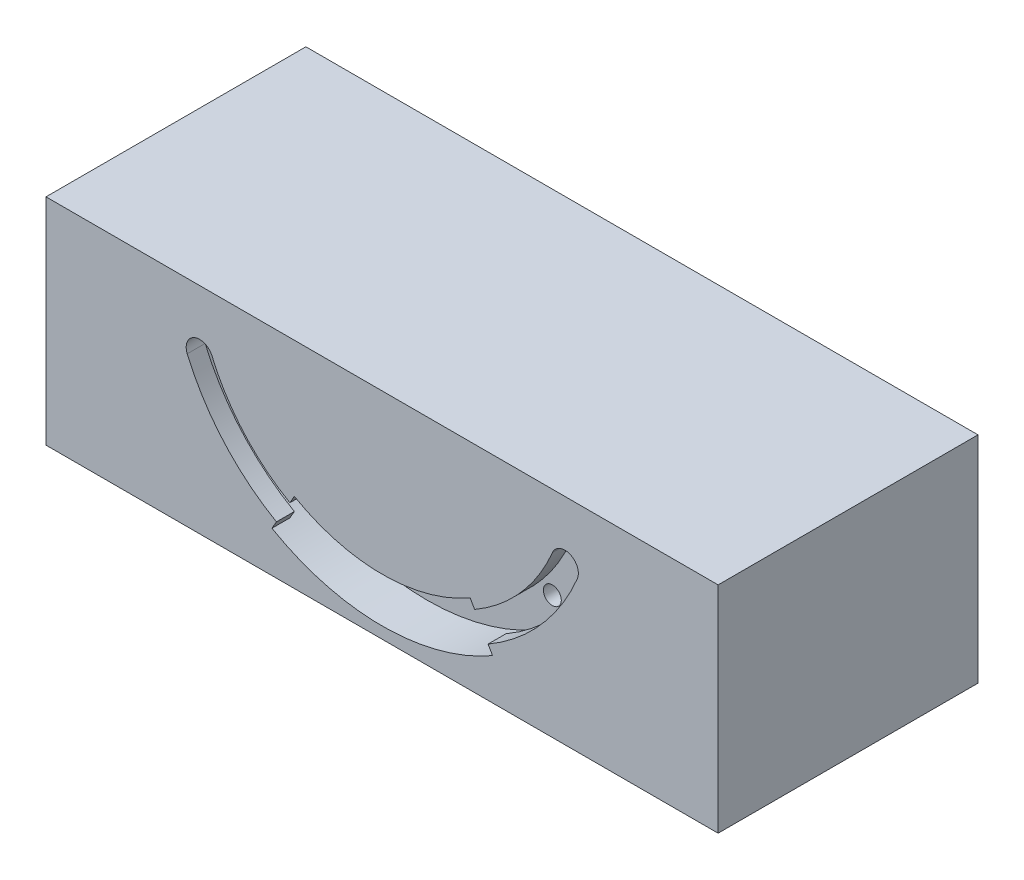
ISO-10303-21;
HEADER;
FILE_DESCRIPTION(('STEP AP214'),'2;1');
FILE_NAME('part.step','',(''),(''),'','','');
FILE_SCHEMA(('AUTOMOTIVE_DESIGN { 1 0 10303 214 1 1 1 1 }'));
ENDSEC;
DATA;
#1=APPLICATION_CONTEXT('core data for automotive mechanical design processes');
#2=APPLICATION_PROTOCOL_DEFINITION('international standard','automotive_design',2000,#1);
#3=PRODUCT_CONTEXT('',#1,'mechanical');
#4=PRODUCT('Part','Part','',(#3));
#5=PRODUCT_RELATED_PRODUCT_CATEGORY('part','',(#4));
#6=PRODUCT_DEFINITION_FORMATION('','',#4);
#7=PRODUCT_DEFINITION_CONTEXT('part definition',#1,'design');
#8=PRODUCT_DEFINITION('design','',#6,#7);
#9=PRODUCT_DEFINITION_SHAPE('','',#8);
#10=(LENGTH_UNIT() NAMED_UNIT(*) SI_UNIT(.MILLI.,.METRE.));
#11=(NAMED_UNIT(*) PLANE_ANGLE_UNIT() SI_UNIT($,.RADIAN.));
#12=(NAMED_UNIT(*) SI_UNIT($,.STERADIAN.) SOLID_ANGLE_UNIT());
#13=UNCERTAINTY_MEASURE_WITH_UNIT(LENGTH_MEASURE(1.E-05),#10,'distance_accuracy_value','');
#14=(GEOMETRIC_REPRESENTATION_CONTEXT(3) GLOBAL_UNCERTAINTY_ASSIGNED_CONTEXT((#13)) GLOBAL_UNIT_ASSIGNED_CONTEXT((#10,
#11,#12)) REPRESENTATION_CONTEXT('',''));
#15=CARTESIAN_POINT('',(0.,0.,0.));
#16=DIRECTION('',(0.,0.,1.));
#17=DIRECTION('',(1.,0.,0.));
#18=AXIS2_PLACEMENT_3D('',#15,#16,#17);
#19=CARTESIAN_POINT('',(0.,0.,24.));
#20=DIRECTION('',(0.,0.,1.));
#21=DIRECTION('',(1.,0.,0.));
#22=AXIS2_PLACEMENT_3D('',#19,#20,#21);
#23=PLANE('',#22);
#24=CARTESIAN_POINT('',(13.8966836043243,22.0549149236108,24.));
#25=DIRECTION('',(0.,0.,1.));
#26=DIRECTION('',(1.,0.,0.));
#27=AXIS2_PLACEMENT_3D('',#24,#25,#26);
#28=CIRCLE('',#27,24.6185736613528);
#29=CARTESIAN_POINT('',(26.2059704350007,0.734604727940843,24.));
#30=VERTEX_POINT('',#29);
#31=CARTESIAN_POINT('',(36.582455444252,12.4930152616086,24.));
#32=VERTEX_POINT('',#31);
#33=EDGE_CURVE('E366',#30,#32,#28,.T.);
#34=ORIENTED_EDGE('',*,*,#33,.F.);
#35=DIRECTION('',(-0.500000000000004,0.866025403784437,0.));
#36=VECTOR('',#35,1.);
#37=CARTESIAN_POINT('',(19.9725710043189,11.5311692457526,24.));
#38=LINE('',#37,#36);
#39=CARTESIAN_POINT('',(25.7059704350007,1.60063013172528,24.));
#40=VERTEX_POINT('',#39);
#41=EDGE_CURVE('E264',#30,#40,#38,.T.);
#42=ORIENTED_EDGE('',*,*,#41,.T.);
#43=CARTESIAN_POINT('',(13.8966836043243,22.0549149236108,24.));
#44=DIRECTION('',(0.,0.,1.));
#45=DIRECTION('',(1.,0.,0.));
#46=AXIS2_PLACEMENT_3D('',#43,#44,#45);
#47=CIRCLE('',#46,23.6185736613528);
#48=CARTESIAN_POINT('',(35.6609653468975,12.8814171159781,24.));
#49=VERTEX_POINT('',#48);
#50=EDGE_CURVE('E283',#40,#49,#47,.T.);
#51=ORIENTED_EDGE('',*,*,#50,.T.);
#52=CARTESIAN_POINT('',(34.2787302008658,13.4640198975324,24.));
#53=DIRECTION('',(0.,0.,1.));
#54=DIRECTION('',(1.,0.,0.));
#55=AXIS2_PLACEMENT_3D('',#52,#53,#54);
#56=CIRCLE('',#55,1.5);
#57=CARTESIAN_POINT('',(32.8964950548342,14.0466226790867,24.));
#58=VERTEX_POINT('',#57);
#59=EDGE_CURVE('E287',#49,#58,#56,.T.);
#60=ORIENTED_EDGE('',*,*,#59,.T.);
#61=CARTESIAN_POINT('',(13.8966836043243,22.0549149236108,24.));
#62=DIRECTION('',(0.,0.,-1.));
#63=DIRECTION('',(1.,0.,0.));
#64=AXIS2_PLACEMENT_3D('',#61,#62,#63);
#65=CIRCLE('',#64,20.6185736613528);
#66=CARTESIAN_POINT('',(24.2059704350007,4.19870634307859,24.));
#67=VERTEX_POINT('',#66);
#68=EDGE_CURVE('E269',#58,#67,#65,.T.);
#69=ORIENTED_EDGE('',*,*,#68,.T.);
#70=CARTESIAN_POINT('',(23.7059704350007,5.06473174686303,24.));
#71=VERTEX_POINT('',#70);
#72=EDGE_CURVE('E260',#67,#71,#38,.T.);
#73=ORIENTED_EDGE('',*,*,#72,.T.);
#74=CARTESIAN_POINT('',(13.8966836043243,22.0549149236108,24.));
#75=DIRECTION('',(0.,0.,-1.));
#76=DIRECTION('',(1.,0.,0.));
#77=AXIS2_PLACEMENT_3D('',#74,#75,#76);
#78=CIRCLE('',#77,19.6185736613528);
#79=CARTESIAN_POINT('',(31.9750049574797,14.4350245334562,24.));
#80=VERTEX_POINT('',#79);
#81=EDGE_CURVE('E356',#80,#71,#78,.T.);
#82=ORIENTED_EDGE('',*,*,#81,.F.);
#83=CARTESIAN_POINT('',(34.2787302008658,13.4640198975324,24.));
#84=DIRECTION('',(0.,0.,1.));
#85=DIRECTION('',(1.,0.,0.));
#86=AXIS2_PLACEMENT_3D('',#83,#84,#85);
#87=CIRCLE('',#86,2.5);
#88=EDGE_CURVE('E370',#32,#80,#87,.T.);
#89=ORIENTED_EDGE('',*,*,#88,.F.);
#90=EDGE_LOOP('',(#34,#42,#51,#60,#69,#73,#82,#89));
#91=FACE_BOUND('',#90,.T.);
#92=ADVANCED_FACE('F37',(#91),#23,.F.);
#93=CARTESIAN_POINT('',(13.8966836043243,22.0549149236108,26.));
#94=DIRECTION('',(0.,0.,-1.));
#95=DIRECTION('',(-1.,0.,0.));
#96=AXIS2_PLACEMENT_3D('',#93,#94,#95);
#97=CYLINDRICAL_SURFACE('',#96,23.6185736613528);
#98=DIRECTION('',(0.,0.,-1.));
#99=VECTOR('',#98,1.);
#100=CARTESIAN_POINT('',(25.7059704350007,1.60063013172528,26.));
#101=LINE('',#100,#99);
#102=CARTESIAN_POINT('',(25.7059704350007,1.60063013172527,26.));
#103=VERTEX_POINT('',#102);
#104=EDGE_CURVE('E263',#103,#40,#101,.T.);
#105=ORIENTED_EDGE('',*,*,#104,.F.);
#106=CARTESIAN_POINT('',(13.8966836043243,22.0549149236108,26.));
#107=DIRECTION('',(0.,0.,1.));
#108=DIRECTION('',(1.,0.,0.));
#109=AXIS2_PLACEMENT_3D('',#106,#107,#108);
#110=CIRCLE('',#109,23.6185736613528);
#111=CARTESIAN_POINT('',(35.6609653468975,12.8814171159781,26.));
#112=VERTEX_POINT('',#111);
#113=EDGE_CURVE('E268',#103,#112,#110,.T.);
#114=ORIENTED_EDGE('',*,*,#113,.T.);
#115=DIRECTION('',(0.,0.,-1.));
#116=VECTOR('',#115,1.);
#117=CARTESIAN_POINT('',(35.6609653468975,12.8814171159781,26.));
#118=LINE('',#117,#116);
#119=EDGE_CURVE('E297',#112,#49,#118,.T.);
#120=ORIENTED_EDGE('',*,*,#119,.T.);
#121=ORIENTED_EDGE('',*,*,#50,.F.);
#122=EDGE_LOOP('',(#105,#114,#120,#121));
#123=FACE_BOUND('',#122,.T.);
#124=ADVANCED_FACE('F520',(#123),#97,.F.);
#125=CARTESIAN_POINT('',(13.8966836043243,22.0549149236108,26.));
#126=DIRECTION('',(0.,0.,-1.));
#127=DIRECTION('',(-1.,0.,0.));
#128=AXIS2_PLACEMENT_3D('',#125,#126,#127);
#129=CYLINDRICAL_SURFACE('',#128,20.6185736613528);
#130=DIRECTION('',(0.,0.,-1.));
#131=VECTOR('',#130,1.);
#132=CARTESIAN_POINT('',(24.2059704350007,4.19870634307859,26.));
#133=LINE('',#132,#131);
#134=CARTESIAN_POINT('',(24.2059704350007,4.19870634307859,26.));
#135=VERTEX_POINT('',#134);
#136=EDGE_CURVE('E11',#67,#135,#133,.F.);
#137=ORIENTED_EDGE('',*,*,#136,.F.);
#138=ORIENTED_EDGE('',*,*,#68,.F.);
#139=DIRECTION('',(0.,0.,-1.));
#140=VECTOR('',#139,1.);
#141=CARTESIAN_POINT('',(32.8964950548342,14.0466226790867,26.));
#142=LINE('',#141,#140);
#143=CARTESIAN_POINT('',(32.8964950548342,14.0466226790867,26.));
#144=VERTEX_POINT('',#143);
#145=EDGE_CURVE('E295',#144,#58,#142,.T.);
#146=ORIENTED_EDGE('',*,*,#145,.F.);
#147=CARTESIAN_POINT('',(13.8966836043243,22.0549149236108,26.));
#148=DIRECTION('',(0.,0.,-1.));
#149=DIRECTION('',(1.,0.,0.));
#150=AXIS2_PLACEMENT_3D('',#147,#148,#149);
#151=CIRCLE('',#150,20.6185736613528);
#152=EDGE_CURVE('E276',#144,#135,#151,.T.);
#153=ORIENTED_EDGE('',*,*,#152,.T.);
#154=EDGE_LOOP('',(#137,#138,#146,#153));
#155=FACE_BOUND('',#154,.T.);
#156=ADVANCED_FACE('F508',(#155),#129,.T.);
#157=CARTESIAN_POINT('',(-18.625,18.15625,-1.));
#158=DIRECTION('',(-1.,0.,0.));
#159=DIRECTION('',(0.,-1.,0.));
#160=AXIS2_PLACEMENT_3D('',#157,#158,#159);
#161=PLANE('',#160);
#162=DIRECTION('',(0.,-1.,0.));
#163=VECTOR('',#162,1.);
#164=CARTESIAN_POINT('',(-18.625,18.15625,19.));
#165=LINE('',#164,#163);
#166=CARTESIAN_POINT('',(-18.625,18.15625,19.));
#167=VERTEX_POINT('',#166);
#168=CARTESIAN_POINT('',(-18.625,-1.84375,19.));
#169=VERTEX_POINT('',#168);
#170=EDGE_CURVE('E401',#167,#169,#165,.T.);
#171=ORIENTED_EDGE('',*,*,#170,.T.);
#172=DIRECTION('',(0.,0.,1.));
#173=VECTOR('',#172,1.);
#174=CARTESIAN_POINT('',(-18.625,-1.84375,-1.));
#175=LINE('',#174,#173);
#176=CARTESIAN_POINT('',(-18.625,-1.84375,-1.));
#177=VERTEX_POINT('',#176);
#178=EDGE_CURVE('E400',#177,#169,#175,.T.);
#179=ORIENTED_EDGE('',*,*,#178,.F.);
#180=DIRECTION('',(0.,-1.,0.));
#181=VECTOR('',#180,1.);
#182=CARTESIAN_POINT('',(-18.625,18.15625,-1.));
#183=LINE('',#182,#181);
#184=CARTESIAN_POINT('',(-18.625,18.15625,-1.));
#185=VERTEX_POINT('',#184);
#186=EDGE_CURVE('E387',#185,#177,#183,.T.);
#187=ORIENTED_EDGE('',*,*,#186,.F.);
#188=DIRECTION('',(0.,0.,1.));
#189=VECTOR('',#188,1.);
#190=CARTESIAN_POINT('',(-18.625,18.15625,-1.));
#191=LINE('',#190,#189);
#192=EDGE_CURVE('E413',#185,#167,#191,.T.);
#193=ORIENTED_EDGE('',*,*,#192,.T.);
#194=EDGE_LOOP('',(#171,#179,#187,#193));
#195=FACE_BOUND('',#194,.T.);
#196=ADVANCED_FACE('F593',(#195),#161,.F.);
#197=CARTESIAN_POINT('',(-18.625,18.15625,-1.));
#198=DIRECTION('',(0.,1.,0.));
#199=DIRECTION('',(0.,0.,1.));
#200=AXIS2_PLACEMENT_3D('',#197,#198,#199);
#201=PLANE('',#200);
#202=DIRECTION('',(-1.,0.,0.));
#203=VECTOR('',#202,1.);
#204=CARTESIAN_POINT('',(-18.625,18.15625,19.));
#205=LINE('',#204,#203);
#206=CARTESIAN_POINT('',(11.375,18.15625,19.));
#207=VERTEX_POINT('',#206);
#208=EDGE_CURVE('E391',#207,#167,#205,.T.);
#209=ORIENTED_EDGE('',*,*,#208,.T.);
#210=ORIENTED_EDGE('',*,*,#192,.F.);
#211=DIRECTION('',(-1.,0.,0.));
#212=VECTOR('',#211,1.);
#213=CARTESIAN_POINT('',(-18.625,18.15625,-1.));
#214=LINE('',#213,#212);
#215=CARTESIAN_POINT('',(11.375,18.15625,-1.));
#216=VERTEX_POINT('',#215);
#217=EDGE_CURVE('E397',#216,#185,#214,.T.);
#218=ORIENTED_EDGE('',*,*,#217,.F.);
#219=DIRECTION('',(0.,0.,1.));
#220=VECTOR('',#219,1.);
#221=CARTESIAN_POINT('',(11.375,18.15625,-1.));
#222=LINE('',#221,#220);
#223=EDGE_CURVE('E416',#216,#207,#222,.T.);
#224=ORIENTED_EDGE('',*,*,#223,.T.);
#225=EDGE_LOOP('',(#209,#210,#218,#224));
#226=FACE_BOUND('',#225,.T.);
#227=ADVANCED_FACE('F589',(#226),#201,.F.);
#228=CARTESIAN_POINT('',(11.375,18.15625,-1.));
#229=DIRECTION('',(1.,0.,0.));
#230=DIRECTION('',(0.,0.,-1.));
#231=AXIS2_PLACEMENT_3D('',#228,#229,#230);
#232=PLANE('',#231);
#233=DIRECTION('',(0.,1.,0.));
#234=VECTOR('',#233,1.);
#235=CARTESIAN_POINT('',(11.375,18.15625,19.));
#236=LINE('',#235,#234);
#237=CARTESIAN_POINT('',(11.375,-1.84375,19.));
#238=VERTEX_POINT('',#237);
#239=EDGE_CURVE('E408',#238,#207,#236,.T.);
#240=ORIENTED_EDGE('',*,*,#239,.T.);
#241=ORIENTED_EDGE('',*,*,#223,.F.);
#242=DIRECTION('',(0.,1.,0.));
#243=VECTOR('',#242,1.);
#244=CARTESIAN_POINT('',(11.375,18.15625,-1.));
#245=LINE('',#244,#243);
#246=CARTESIAN_POINT('',(11.375,-1.84375,-1.));
#247=VERTEX_POINT('',#246);
#248=EDGE_CURVE('E394',#247,#216,#245,.T.);
#249=ORIENTED_EDGE('',*,*,#248,.F.);
#250=DIRECTION('',(0.,0.,1.));
#251=VECTOR('',#250,1.);
#252=CARTESIAN_POINT('',(11.375,-1.84375,-1.));
#253=LINE('',#252,#251);
#254=EDGE_CURVE('E418',#247,#238,#253,.T.);
#255=ORIENTED_EDGE('',*,*,#254,.T.);
#256=EDGE_LOOP('',(#240,#241,#249,#255));
#257=FACE_BOUND('',#256,.T.);
#258=ADVANCED_FACE('F592',(#257),#232,.F.);
#259=CARTESIAN_POINT('',(-18.625,-1.84375,-1.));
#260=DIRECTION('',(0.,-1.,0.));
#261=DIRECTION('',(0.,0.,-1.));
#262=AXIS2_PLACEMENT_3D('',#259,#260,#261);
#263=PLANE('',#262);
#264=DIRECTION('',(1.,0.,0.));
#265=VECTOR('',#264,1.);
#266=CARTESIAN_POINT('',(-18.625,-1.84375,19.));
#267=LINE('',#266,#265);
#268=EDGE_CURVE('E404',#169,#238,#267,.T.);
#269=ORIENTED_EDGE('',*,*,#268,.T.);
#270=ORIENTED_EDGE('',*,*,#254,.F.);
#271=DIRECTION('',(1.,0.,0.));
#272=VECTOR('',#271,1.);
#273=CARTESIAN_POINT('',(-18.625,-1.84375,-1.));
#274=LINE('',#273,#272);
#275=EDGE_CURVE('E390',#177,#247,#274,.T.);
#276=ORIENTED_EDGE('',*,*,#275,.F.);
#277=ORIENTED_EDGE('',*,*,#178,.T.);
#278=EDGE_LOOP('',(#269,#270,#276,#277));
#279=FACE_BOUND('',#278,.T.);
#280=ADVANCED_FACE('F584',(#279),#263,.F.);
#281=CARTESIAN_POINT('',(0.,0.,-1.));
#282=DIRECTION('',(0.,0.,1.));
#283=DIRECTION('',(1.,0.,0.));
#284=AXIS2_PLACEMENT_3D('',#281,#282,#283);
#285=PLANE('',#284);
#286=CARTESIAN_POINT('',(-0.111682334904026,5.08779981785315,-1.));
#287=DIRECTION('',(0.,0.,1.));
#288=DIRECTION('',(1.,0.,0.));
#289=AXIS2_PLACEMENT_3D('',#286,#287,#288);
#290=CIRCLE('',#289,1.5);
#291=CARTESIAN_POINT('',(1.38831766509598,5.08779981785315,-1.));
#292=VERTEX_POINT('',#291);
#293=EDGE_CURVE('E330',#292,#292,#290,.F.);
#294=ORIENTED_EDGE('',*,*,#293,.T.);
#295=EDGE_LOOP('',(#294));
#296=FACE_BOUND('',#295,.T.);
#297=CARTESIAN_POINT('',(-4.93020540214926,5.0758555953888,-1.));
#298=DIRECTION('',(0.,0.,1.));
#299=DIRECTION('',(1.,0.,0.));
#300=AXIS2_PLACEMENT_3D('',#297,#298,#299);
#301=CIRCLE('',#300,1.50000000000001);
#302=CARTESIAN_POINT('',(-3.43020540214925,5.0758555953888,-1.));
#303=VERTEX_POINT('',#302);
#304=EDGE_CURVE('E315',#303,#303,#301,.F.);
#305=ORIENTED_EDGE('',*,*,#304,.T.);
#306=EDGE_LOOP('',(#305));
#307=FACE_BOUND('',#306,.T.);
#308=ORIENTED_EDGE('',*,*,#186,.T.);
#309=ORIENTED_EDGE('',*,*,#275,.T.);
#310=ORIENTED_EDGE('',*,*,#248,.T.);
#311=ORIENTED_EDGE('',*,*,#217,.T.);
#312=EDGE_LOOP('',(#308,#309,#310,#311));
#313=FACE_BOUND('',#312,.T.);
#314=ADVANCED_FACE('F581',(#296,#307,#313),#285,.T.);
#315=CARTESIAN_POINT('',(0.,0.,19.));
#316=DIRECTION('',(0.,0.,1.));
#317=DIRECTION('',(1.,0.,0.));
#318=AXIS2_PLACEMENT_3D('',#315,#316,#317);
#319=PLANE('',#318);
#320=CARTESIAN_POINT('',(-0.124999999999997,4.90625,19.));
#321=DIRECTION('',(0.,0.,1.));
#322=DIRECTION('',(1.,0.,0.));
#323=AXIS2_PLACEMENT_3D('',#320,#321,#322);
#324=CIRCLE('',#323,1.);
#325=CARTESIAN_POINT('',(0.875000000000003,4.90625,19.));
#326=VERTEX_POINT('',#325);
#327=EDGE_CURVE('E347',#326,#326,#324,.F.);
#328=ORIENTED_EDGE('',*,*,#327,.F.);
#329=EDGE_LOOP('',(#328));
#330=FACE_BOUND('',#329,.T.);
#331=ORIENTED_EDGE('',*,*,#170,.F.);
#332=ORIENTED_EDGE('',*,*,#208,.F.);
#333=ORIENTED_EDGE('',*,*,#239,.F.);
#334=ORIENTED_EDGE('',*,*,#268,.F.);
#335=EDGE_LOOP('',(#331,#332,#333,#334));
#336=FACE_BOUND('',#335,.T.);
#337=ADVANCED_FACE('F568',(#330,#336),#319,.F.);
#338=CARTESIAN_POINT('',(-0.124999999999997,4.90625,-3.001));
#339=DIRECTION('',(0.,0.,1.));
#340=DIRECTION('',(1.,0.,0.));
#341=AXIS2_PLACEMENT_3D('',#338,#339,#340);
#342=CYLINDRICAL_SURFACE('',#341,1.);
#343=CARTESIAN_POINT('',(-0.124999999999997,4.90625,21.));
#344=DIRECTION('',(0.,0.,1.));
#345=DIRECTION('',(1.,0.,0.));
#346=AXIS2_PLACEMENT_3D('',#343,#344,#345);
#347=CIRCLE('',#346,1.);
#348=CARTESIAN_POINT('',(0.875000000000003,4.90625,21.));
#349=VERTEX_POINT('',#348);
#350=EDGE_CURVE('E323',#349,#349,#347,.F.);
#351=ORIENTED_EDGE('',*,*,#350,.F.);
#352=EDGE_LOOP('',(#351));
#353=FACE_BOUND('',#352,.T.);
#354=ORIENTED_EDGE('',*,*,#327,.T.);
#355=EDGE_LOOP('',(#354));
#356=FACE_BOUND('',#355,.T.);
#357=ADVANCED_FACE('F565',(#353,#356),#342,.F.);
#358=CARTESIAN_POINT('',(-23.625,20.15625,-3.));
#359=DIRECTION('',(-1.,0.,0.));
#360=DIRECTION('',(0.,-1.,0.));
#361=AXIS2_PLACEMENT_3D('',#358,#359,#360);
#362=PLANE('',#361);
#363=DIRECTION('',(0.,0.,1.));
#364=VECTOR('',#363,1.);
#365=CARTESIAN_POINT('',(-23.625,-3.84375,-3.));
#366=LINE('',#365,#364);
#367=CARTESIAN_POINT('',(-23.625,-3.84375,-3.));
#368=VERTEX_POINT('',#367);
#369=CARTESIAN_POINT('',(-23.625,-3.84375,26.));
#370=VERTEX_POINT('',#369);
#371=EDGE_CURVE('E462',#368,#370,#366,.T.);
#372=ORIENTED_EDGE('',*,*,#371,.T.);
#373=DIRECTION('',(0.,-1.,0.));
#374=VECTOR('',#373,1.);
#375=CARTESIAN_POINT('',(-23.625,20.15625,26.));
#376=LINE('',#375,#374);
#377=CARTESIAN_POINT('',(-23.625,20.15625,26.));
#378=VERTEX_POINT('',#377);
#379=EDGE_CURVE('E306',#378,#370,#376,.T.);
#380=ORIENTED_EDGE('',*,*,#379,.F.);
#381=DIRECTION('',(0.,0.,1.));
#382=VECTOR('',#381,1.);
#383=CARTESIAN_POINT('',(-23.625,20.15625,-3.));
#384=LINE('',#383,#382);
#385=CARTESIAN_POINT('',(-23.625,20.15625,-3.));
#386=VERTEX_POINT('',#385);
#387=EDGE_CURVE('E463',#386,#378,#384,.T.);
#388=ORIENTED_EDGE('',*,*,#387,.F.);
#389=DIRECTION('',(0.,-1.,0.));
#390=VECTOR('',#389,1.);
#391=CARTESIAN_POINT('',(-23.625,20.15625,-3.));
#392=LINE('',#391,#390);
#393=EDGE_CURVE('E415',#386,#368,#392,.T.);
#394=ORIENTED_EDGE('',*,*,#393,.T.);
#395=EDGE_LOOP('',(#372,#380,#388,#394));
#396=FACE_BOUND('',#395,.T.);
#397=ADVANCED_FACE('F39',(#396),#362,.T.);
#398=CARTESIAN_POINT('',(-23.625,20.15625,-3.));
#399=DIRECTION('',(0.,1.,0.));
#400=DIRECTION('',(0.,0.,1.));
#401=AXIS2_PLACEMENT_3D('',#398,#399,#400);
#402=PLANE('',#401);
#403=ORIENTED_EDGE('',*,*,#387,.T.);
#404=DIRECTION('',(-1.,0.,0.));
#405=VECTOR('',#404,1.);
#406=CARTESIAN_POINT('',(51.375,20.15625,26.));
#407=LINE('',#406,#405);
#408=CARTESIAN_POINT('',(51.375,20.15625,26.));
#409=VERTEX_POINT('',#408);
#410=EDGE_CURVE('E303',#409,#378,#407,.T.);
#411=ORIENTED_EDGE('',*,*,#410,.F.);
#412=DIRECTION('',(0.,0.,1.));
#413=VECTOR('',#412,1.);
#414=CARTESIAN_POINT('',(51.375,20.15625,-3.));
#415=LINE('',#414,#413);
#416=CARTESIAN_POINT('',(51.375,20.15625,-3.));
#417=VERTEX_POINT('',#416);
#418=EDGE_CURVE('E465',#417,#409,#415,.T.);
#419=ORIENTED_EDGE('',*,*,#418,.F.);
#420=DIRECTION('',(-1.,0.,0.));
#421=VECTOR('',#420,1.);
#422=CARTESIAN_POINT('',(-23.625,20.15625,-3.));
#423=LINE('',#422,#421);
#424=EDGE_CURVE('E459',#417,#386,#423,.T.);
#425=ORIENTED_EDGE('',*,*,#424,.T.);
#426=EDGE_LOOP('',(#403,#411,#419,#425));
#427=FACE_BOUND('',#426,.T.);
#428=ADVANCED_FACE('F631',(#427),#402,.T.);
#429=CARTESIAN_POINT('',(51.375,20.15625,-3.));
#430=DIRECTION('',(1.,0.,0.));
#431=DIRECTION('',(0.,1.,0.));
#432=AXIS2_PLACEMENT_3D('',#429,#430,#431);
#433=PLANE('',#432);
#434=ORIENTED_EDGE('',*,*,#418,.T.);
#435=DIRECTION('',(0.,1.,0.));
#436=VECTOR('',#435,1.);
#437=CARTESIAN_POINT('',(51.375,-3.84375,26.));
#438=LINE('',#437,#436);
#439=CARTESIAN_POINT('',(51.375,-3.84375,26.));
#440=VERTEX_POINT('',#439);
#441=EDGE_CURVE('E312',#440,#409,#438,.T.);
#442=ORIENTED_EDGE('',*,*,#441,.F.);
#443=DIRECTION('',(0.,0.,1.));
#444=VECTOR('',#443,1.);
#445=CARTESIAN_POINT('',(51.375,-3.84375,-3.));
#446=LINE('',#445,#444);
#447=CARTESIAN_POINT('',(51.375,-3.84375,-3.));
#448=VERTEX_POINT('',#447);
#449=EDGE_CURVE('E467',#448,#440,#446,.T.);
#450=ORIENTED_EDGE('',*,*,#449,.F.);
#451=DIRECTION('',(0.,1.,0.));
#452=VECTOR('',#451,1.);
#453=CARTESIAN_POINT('',(51.375,20.15625,-3.));
#454=LINE('',#453,#452);
#455=EDGE_CURVE('E456',#448,#417,#454,.T.);
#456=ORIENTED_EDGE('',*,*,#455,.T.);
#457=EDGE_LOOP('',(#434,#442,#450,#456));
#458=FACE_BOUND('',#457,.T.);
#459=ADVANCED_FACE('F634',(#458),#433,.T.);
#460=CARTESIAN_POINT('',(-23.625,-3.84375,-3.));
#461=DIRECTION('',(0.,-1.,0.));
#462=DIRECTION('',(0.,0.,-1.));
#463=AXIS2_PLACEMENT_3D('',#460,#461,#462);
#464=PLANE('',#463);
#465=ORIENTED_EDGE('',*,*,#449,.T.);
#466=DIRECTION('',(1.,0.,0.));
#467=VECTOR('',#466,1.);
#468=CARTESIAN_POINT('',(-23.625,-3.84375,26.));
#469=LINE('',#468,#467);
#470=EDGE_CURVE('E309',#370,#440,#469,.T.);
#471=ORIENTED_EDGE('',*,*,#470,.F.);
#472=ORIENTED_EDGE('',*,*,#371,.F.);
#473=DIRECTION('',(1.,0.,0.));
#474=VECTOR('',#473,1.);
#475=CARTESIAN_POINT('',(-23.625,-3.84375,-3.));
#476=LINE('',#475,#474);
#477=EDGE_CURVE('E453',#368,#448,#476,.T.);
#478=ORIENTED_EDGE('',*,*,#477,.T.);
#479=EDGE_LOOP('',(#465,#471,#472,#478));
#480=FACE_BOUND('',#479,.T.);
#481=ADVANCED_FACE('F629',(#480),#464,.T.);
#482=CARTESIAN_POINT('',(0.,0.,-3.));
#483=DIRECTION('',(0.,0.,1.));
#484=DIRECTION('',(1.,0.,0.));
#485=AXIS2_PLACEMENT_3D('',#482,#483,#484);
#486=PLANE('',#485);
#487=CARTESIAN_POINT('',(32.6802054021492,5.07585559538879,-3.));
#488=DIRECTION('',(0.,0.,-1.));
#489=DIRECTION('',(-1.,0.,0.));
#490=AXIS2_PLACEMENT_3D('',#487,#488,#489);
#491=CIRCLE('',#490,1.5);
#492=CARTESIAN_POINT('',(31.1802054021492,5.07585559538879,-3.));
#493=VERTEX_POINT('',#492);
#494=EDGE_CURVE('E319',#493,#493,#491,.T.);
#495=ORIENTED_EDGE('',*,*,#494,.F.);
#496=EDGE_LOOP('',(#495));
#497=FACE_BOUND('',#496,.T.);
#498=CARTESIAN_POINT('',(27.861682334904,5.08779981785314,-3.));
#499=DIRECTION('',(0.,0.,-1.));
#500=DIRECTION('',(-1.,0.,0.));
#501=AXIS2_PLACEMENT_3D('',#498,#499,#500);
#502=CIRCLE('',#501,1.5);
#503=CARTESIAN_POINT('',(26.361682334904,5.08779981785314,-3.));
#504=VERTEX_POINT('',#503);
#505=EDGE_CURVE('E320',#504,#504,#502,.T.);
#506=ORIENTED_EDGE('',*,*,#505,.F.);
#507=EDGE_LOOP('',(#506));
#508=FACE_BOUND('',#507,.T.);
#509=CARTESIAN_POINT('',(-0.111682334904026,5.08779981785315,-3.));
#510=DIRECTION('',(0.,0.,-1.));
#511=DIRECTION('',(1.,0.,0.));
#512=AXIS2_PLACEMENT_3D('',#509,#510,#511);
#513=CIRCLE('',#512,1.5);
#514=CARTESIAN_POINT('',(1.38831766509598,5.08779981785315,-3.));
#515=VERTEX_POINT('',#514);
#516=EDGE_CURVE('E327',#515,#515,#513,.T.);
#517=ORIENTED_EDGE('',*,*,#516,.F.);
#518=EDGE_LOOP('',(#517));
#519=FACE_BOUND('',#518,.T.);
#520=CARTESIAN_POINT('',(-4.93020540214926,5.0758555953888,-3.));
#521=DIRECTION('',(0.,0.,-1.));
#522=DIRECTION('',(1.,0.,0.));
#523=AXIS2_PLACEMENT_3D('',#520,#521,#522);
#524=CIRCLE('',#523,1.50000000000001);
#525=CARTESIAN_POINT('',(-3.43020540214925,5.0758555953888,-3.));
#526=VERTEX_POINT('',#525);
#527=EDGE_CURVE('E333',#526,#526,#524,.T.);
#528=ORIENTED_EDGE('',*,*,#527,.F.);
#529=EDGE_LOOP('',(#528));
#530=FACE_BOUND('',#529,.T.);
#531=ORIENTED_EDGE('',*,*,#393,.F.);
#532=ORIENTED_EDGE('',*,*,#424,.F.);
#533=ORIENTED_EDGE('',*,*,#455,.F.);
#534=ORIENTED_EDGE('',*,*,#477,.F.);
#535=EDGE_LOOP('',(#531,#532,#533,#534));
#536=FACE_BOUND('',#535,.T.);
#537=ADVANCED_FACE('F580',(#497,#508,#519,#530,#536),#486,.F.);
#538=CARTESIAN_POINT('',(-6.48098120314558,13.4536314259523,21.));
#539=DIRECTION('',(0.,0.,1.));
#540=DIRECTION('',(1.,0.,0.));
#541=AXIS2_PLACEMENT_3D('',#538,#539,#540);
#542=CYLINDRICAL_SURFACE('',#541,2.5);
#543=CARTESIAN_POINT('',(-6.48098120314558,13.4536314259523,24.));
#544=DIRECTION('',(0.,0.,1.));
#545=DIRECTION('',(1.,0.,0.));
#546=AXIS2_PLACEMENT_3D('',#543,#544,#545);
#547=CIRCLE('',#546,2.5);
#548=CARTESIAN_POINT('',(-4.17775122102028,14.4258102415203,24.));
#549=VERTEX_POINT('',#548);
#550=CARTESIAN_POINT('',(-8.78421118527088,12.4814526103844,24.));
#551=VERTEX_POINT('',#550);
#552=EDGE_CURVE('E343',#549,#551,#547,.T.);
#553=ORIENTED_EDGE('',*,*,#552,.T.);
#554=DIRECTION('',(0.,0.,1.));
#555=VECTOR('',#554,1.);
#556=CARTESIAN_POINT('',(-8.78421118527088,12.4814526103844,21.));
#557=LINE('',#556,#555);
#558=CARTESIAN_POINT('',(-8.78421118527088,12.4814526103844,21.));
#559=VERTEX_POINT('',#558);
#560=EDGE_CURVE('E363',#559,#551,#557,.T.);
#561=ORIENTED_EDGE('',*,*,#560,.F.);
#562=CARTESIAN_POINT('',(-6.48098120314558,13.4536314259523,21.));
#563=DIRECTION('',(0.,0.,1.));
#564=DIRECTION('',(1.,0.,0.));
#565=AXIS2_PLACEMENT_3D('',#562,#563,#564);
#566=CIRCLE('',#565,2.5);
#567=CARTESIAN_POINT('',(-4.17775122102028,14.4258102415203,21.));
#568=VERTEX_POINT('',#567);
#569=EDGE_CURVE('E352',#568,#559,#566,.T.);
#570=ORIENTED_EDGE('',*,*,#569,.F.);
#571=DIRECTION('',(0.,0.,1.));
#572=VECTOR('',#571,1.);
#573=CARTESIAN_POINT('',(-4.17775122102028,14.4258102415203,21.));
#574=LINE('',#573,#572);
#575=EDGE_CURVE('E375',#568,#549,#574,.T.);
#576=ORIENTED_EDGE('',*,*,#575,.T.);
#577=EDGE_LOOP('',(#553,#561,#570,#576));
#578=FACE_BOUND('',#577,.T.);
#579=ADVANCED_FACE('F491',(#578),#542,.F.);
#580=CARTESIAN_POINT('',(13.8966836043243,22.0549149236108,21.));
#581=DIRECTION('',(0.,0.,1.));
#582=DIRECTION('',(1.,0.,0.));
#583=AXIS2_PLACEMENT_3D('',#580,#581,#582);
#584=CYLINDRICAL_SURFACE('',#583,19.6185736613528);
#585=ORIENTED_EDGE('',*,*,#575,.F.);
#586=CARTESIAN_POINT('',(13.8966836043243,22.0549149236108,21.));
#587=DIRECTION('',(0.,0.,-1.));
#588=DIRECTION('',(1.,0.,0.));
#589=AXIS2_PLACEMENT_3D('',#586,#587,#588);
#590=CIRCLE('',#589,19.6185736613528);
#591=CARTESIAN_POINT('',(31.9750049574797,14.4350245334562,21.));
#592=VERTEX_POINT('',#591);
#593=EDGE_CURVE('E361',#592,#568,#590,.T.);
#594=ORIENTED_EDGE('',*,*,#593,.F.);
#595=DIRECTION('',(0.,0.,1.));
#596=VECTOR('',#595,1.);
#597=CARTESIAN_POINT('',(31.9750049574797,14.4350245334562,21.));
#598=LINE('',#597,#596);
#599=EDGE_CURVE('E379',#592,#80,#598,.T.);
#600=ORIENTED_EDGE('',*,*,#599,.T.);
#601=ORIENTED_EDGE('',*,*,#81,.T.);
#602=DIRECTION('',(0.,0.,1.));
#603=VECTOR('',#602,1.);
#604=CARTESIAN_POINT('',(23.7059704350007,5.06473174686303,-4.77336824136625));
#605=LINE('',#604,#603);
#606=CARTESIAN_POINT('',(23.7059704350007,5.06473174686303,26.));
#607=VERTEX_POINT('',#606);
#608=EDGE_CURVE('E234',#71,#607,#605,.T.);
#609=ORIENTED_EDGE('',*,*,#608,.T.);
#610=CARTESIAN_POINT('',(13.8966836043243,22.0549149236108,26.));
#611=DIRECTION('',(0.,0.,-1.));
#612=DIRECTION('',(1.,0.,0.));
#613=AXIS2_PLACEMENT_3D('',#610,#611,#612);
#614=CIRCLE('',#613,19.6185736613528);
#615=CARTESIAN_POINT('',(4.08739677364793,5.06473174686301,26.));
#616=VERTEX_POINT('',#615);
#617=EDGE_CURVE('E230',#607,#616,#614,.T.);
#618=ORIENTED_EDGE('',*,*,#617,.T.);
#619=DIRECTION('',(0.,0.,1.));
#620=VECTOR('',#619,1.);
#621=CARTESIAN_POINT('',(4.08739677364793,5.06473174686301,-4.77336824136625));
#622=LINE('',#621,#620);
#623=CARTESIAN_POINT('',(4.08739677364793,5.06473174686301,24.));
#624=VERTEX_POINT('',#623);
#625=EDGE_CURVE('E219',#624,#616,#622,.T.);
#626=ORIENTED_EDGE('',*,*,#625,.F.);
#627=EDGE_CURVE('E373',#624,#549,#78,.T.);
#628=ORIENTED_EDGE('',*,*,#627,.T.);
#629=EDGE_LOOP('',(#585,#594,#600,#601,#609,#618,#626,#628));
#630=FACE_BOUND('',#629,.T.);
#631=ADVANCED_FACE('F232',(#630),#584,.T.);
#632=CARTESIAN_POINT('',(34.2787302008658,13.4640198975324,21.));
#633=DIRECTION('',(0.,0.,1.));
#634=DIRECTION('',(1.,0.,0.));
#635=AXIS2_PLACEMENT_3D('',#632,#633,#634);
#636=CYLINDRICAL_SURFACE('',#635,2.5);
#637=ORIENTED_EDGE('',*,*,#88,.T.);
#638=ORIENTED_EDGE('',*,*,#599,.F.);
#639=CARTESIAN_POINT('',(34.2787302008658,13.4640198975324,21.));
#640=DIRECTION('',(0.,0.,1.));
#641=DIRECTION('',(1.,0.,0.));
#642=AXIS2_PLACEMENT_3D('',#639,#640,#641);
#643=CIRCLE('',#642,2.5);
#644=CARTESIAN_POINT('',(36.582455444252,12.4930152616086,21.));
#645=VERTEX_POINT('',#644);
#646=EDGE_CURVE('E358',#645,#592,#643,.T.);
#647=ORIENTED_EDGE('',*,*,#646,.F.);
#648=DIRECTION('',(0.,0.,1.));
#649=VECTOR('',#648,1.);
#650=CARTESIAN_POINT('',(36.582455444252,12.4930152616086,21.));
#651=LINE('',#650,#649);
#652=EDGE_CURVE('E382',#645,#32,#651,.T.);
#653=ORIENTED_EDGE('',*,*,#652,.T.);
#654=EDGE_LOOP('',(#637,#638,#647,#653));
#655=FACE_BOUND('',#654,.T.);
#656=ADVANCED_FACE('F498',(#655),#636,.F.);
#657=CARTESIAN_POINT('',(13.8966836043243,22.0549149236108,21.));
#658=DIRECTION('',(0.,0.,1.));
#659=DIRECTION('',(1.,0.,0.));
#660=AXIS2_PLACEMENT_3D('',#657,#658,#659);
#661=CYLINDRICAL_SURFACE('',#660,24.6185736613528);
#662=CARTESIAN_POINT('',(1.5873967736479,0.734604727940842,24.));
#663=VERTEX_POINT('',#662);
#664=EDGE_CURVE('E367',#551,#663,#28,.T.);
#665=ORIENTED_EDGE('',*,*,#664,.T.);
#666=DIRECTION('',(0.,0.,1.));
#667=VECTOR('',#666,1.);
#668=CARTESIAN_POINT('',(1.5873967736479,0.734604727940842,-4.77336824136625));
#669=LINE('',#668,#667);
#670=CARTESIAN_POINT('',(1.5873967736479,0.734604727940842,26.));
#671=VERTEX_POINT('',#670);
#672=EDGE_CURVE('E226',#663,#671,#669,.T.);
#673=ORIENTED_EDGE('',*,*,#672,.T.);
#674=CARTESIAN_POINT('',(13.8966836043243,22.0549149236108,26.));
#675=DIRECTION('',(0.,0.,1.));
#676=DIRECTION('',(1.,0.,0.));
#677=AXIS2_PLACEMENT_3D('',#674,#675,#676);
#678=CIRCLE('',#677,24.6185736613528);
#679=CARTESIAN_POINT('',(26.2059704350007,0.734604727940843,26.));
#680=VERTEX_POINT('',#679);
#681=EDGE_CURVE('E245',#671,#680,#678,.T.);
#682=ORIENTED_EDGE('',*,*,#681,.T.);
#683=DIRECTION('',(0.,0.,1.));
#684=VECTOR('',#683,1.);
#685=CARTESIAN_POINT('',(26.2059704350007,0.734604727940843,-4.77336824136625));
#686=LINE('',#685,#684);
#687=EDGE_CURVE('E254',#30,#680,#686,.T.);
#688=ORIENTED_EDGE('',*,*,#687,.F.);
#689=ORIENTED_EDGE('',*,*,#33,.T.);
#690=ORIENTED_EDGE('',*,*,#652,.F.);
#691=CARTESIAN_POINT('',(13.8966836043243,22.0549149236108,21.));
#692=DIRECTION('',(0.,0.,1.));
#693=DIRECTION('',(1.,0.,0.));
#694=AXIS2_PLACEMENT_3D('',#691,#692,#693);
#695=CIRCLE('',#694,24.6185736613528);
#696=EDGE_CURVE('E355',#559,#645,#695,.T.);
#697=ORIENTED_EDGE('',*,*,#696,.F.);
#698=ORIENTED_EDGE('',*,*,#560,.T.);
#699=EDGE_LOOP('',(#665,#673,#682,#688,#689,#690,#697,#698));
#700=FACE_BOUND('',#699,.T.);
#701=ADVANCED_FACE('F486',(#700),#661,.F.);
#702=CARTESIAN_POINT('',(3.70785120058936,17.7542731747816,21.));
#703=DIRECTION('',(0.,0.,1.));
#704=DIRECTION('',(1.,0.,0.));
#705=AXIS2_PLACEMENT_3D('',#702,#703,#704);
#706=PLANE('',#705);
#707=ORIENTED_EDGE('',*,*,#696,.T.);
#708=ORIENTED_EDGE('',*,*,#646,.T.);
#709=ORIENTED_EDGE('',*,*,#593,.T.);
#710=ORIENTED_EDGE('',*,*,#569,.T.);
#711=EDGE_LOOP('',(#707,#708,#709,#710));
#712=FACE_BOUND('',#711,.T.);
#713=ORIENTED_EDGE('',*,*,#350,.T.);
#714=EDGE_LOOP('',(#713));
#715=FACE_BOUND('',#714,.T.);
#716=CARTESIAN_POINT('',(27.875,4.90625,21.));
#717=DIRECTION('',(0.,0.,1.));
#718=DIRECTION('',(1.,0.,0.));
#719=AXIS2_PLACEMENT_3D('',#716,#717,#718);
#720=CIRCLE('',#719,1.);
#721=CARTESIAN_POINT('',(28.875,4.90625,21.));
#722=VERTEX_POINT('',#721);
#723=EDGE_CURVE('E344',#722,#722,#720,.F.);
#724=ORIENTED_EDGE('',*,*,#723,.T.);
#725=EDGE_LOOP('',(#724));
#726=FACE_BOUND('',#725,.T.);
#727=ADVANCED_FACE('F494',(#712,#715,#726),#706,.T.);
#728=CARTESIAN_POINT('',(27.875,4.90625,-3.001));
#729=DIRECTION('',(0.,0.,1.));
#730=DIRECTION('',(1.,0.,0.));
#731=AXIS2_PLACEMENT_3D('',#728,#729,#730);
#732=CYLINDRICAL_SURFACE('',#731,1.);
#733=ORIENTED_EDGE('',*,*,#723,.F.);
#734=EDGE_LOOP('',(#733));
#735=FACE_BOUND('',#734,.T.);
#736=CARTESIAN_POINT('',(27.875,4.90625,19.));
#737=DIRECTION('',(0.,0.,1.));
#738=DIRECTION('',(1.,0.,0.));
#739=AXIS2_PLACEMENT_3D('',#736,#737,#738);
#740=CIRCLE('',#739,1.);
#741=CARTESIAN_POINT('',(28.875,4.90625,19.));
#742=VERTEX_POINT('',#741);
#743=EDGE_CURVE('E340',#742,#742,#740,.F.);
#744=ORIENTED_EDGE('',*,*,#743,.T.);
#745=EDGE_LOOP('',(#744));
#746=FACE_BOUND('',#745,.T.);
#747=ADVANCED_FACE('F560',(#735,#746),#732,.F.);
#748=CARTESIAN_POINT('',(16.375,18.15625,-1.));
#749=DIRECTION('',(-1.,0.,0.));
#750=DIRECTION('',(0.,-1.,0.));
#751=AXIS2_PLACEMENT_3D('',#748,#749,#750);
#752=PLANE('',#751);
#753=DIRECTION('',(0.,-1.,0.));
#754=VECTOR('',#753,1.);
#755=CARTESIAN_POINT('',(16.375,18.15625,19.));
#756=LINE('',#755,#754);
#757=CARTESIAN_POINT('',(16.375,18.15625,19.));
#758=VERTEX_POINT('',#757);
#759=CARTESIAN_POINT('',(16.375,-1.84375,19.));
#760=VERTEX_POINT('',#759);
#761=EDGE_CURVE('E378',#758,#760,#756,.T.);
#762=ORIENTED_EDGE('',*,*,#761,.T.);
#763=DIRECTION('',(0.,0.,1.));
#764=VECTOR('',#763,1.);
#765=CARTESIAN_POINT('',(16.375,-1.84375,-1.));
#766=LINE('',#765,#764);
#767=CARTESIAN_POINT('',(16.375,-1.84375,-1.));
#768=VERTEX_POINT('',#767);
#769=EDGE_CURVE('E434',#768,#760,#766,.T.);
#770=ORIENTED_EDGE('',*,*,#769,.F.);
#771=DIRECTION('',(0.,-1.,0.));
#772=VECTOR('',#771,1.);
#773=CARTESIAN_POINT('',(16.375,18.15625,-1.));
#774=LINE('',#773,#772);
#775=CARTESIAN_POINT('',(16.375,18.15625,-1.));
#776=VERTEX_POINT('',#775);
#777=EDGE_CURVE('E421',#776,#768,#774,.T.);
#778=ORIENTED_EDGE('',*,*,#777,.F.);
#779=DIRECTION('',(0.,0.,1.));
#780=VECTOR('',#779,1.);
#781=CARTESIAN_POINT('',(16.375,18.15625,-1.));
#782=LINE('',#781,#780);
#783=EDGE_CURVE('E405',#776,#758,#782,.T.);
#784=ORIENTED_EDGE('',*,*,#783,.T.);
#785=EDGE_LOOP('',(#762,#770,#778,#784));
#786=FACE_BOUND('',#785,.T.);
#787=ADVANCED_FACE('F563',(#786),#752,.F.);
#788=CARTESIAN_POINT('',(16.375,18.15625,-1.));
#789=DIRECTION('',(0.,1.,0.));
#790=DIRECTION('',(0.,0.,1.));
#791=AXIS2_PLACEMENT_3D('',#788,#789,#790);
#792=PLANE('',#791);
#793=DIRECTION('',(-1.,0.,0.));
#794=VECTOR('',#793,1.);
#795=CARTESIAN_POINT('',(16.375,18.15625,19.));
#796=LINE('',#795,#794);
#797=CARTESIAN_POINT('',(46.375,18.15625,19.));
#798=VERTEX_POINT('',#797);
#799=EDGE_CURVE('E425',#798,#758,#796,.T.);
#800=ORIENTED_EDGE('',*,*,#799,.T.);
#801=ORIENTED_EDGE('',*,*,#783,.F.);
#802=DIRECTION('',(-1.,0.,0.));
#803=VECTOR('',#802,1.);
#804=CARTESIAN_POINT('',(16.375,18.15625,-1.));
#805=LINE('',#804,#803);
#806=CARTESIAN_POINT('',(46.375,18.15625,-1.));
#807=VERTEX_POINT('',#806);
#808=EDGE_CURVE('E431',#807,#776,#805,.T.);
#809=ORIENTED_EDGE('',*,*,#808,.F.);
#810=DIRECTION('',(0.,0.,1.));
#811=VECTOR('',#810,1.);
#812=CARTESIAN_POINT('',(46.375,18.15625,-1.));
#813=LINE('',#812,#811);
#814=EDGE_CURVE('E446',#807,#798,#813,.T.);
#815=ORIENTED_EDGE('',*,*,#814,.T.);
#816=EDGE_LOOP('',(#800,#801,#809,#815));
#817=FACE_BOUND('',#816,.T.);
#818=ADVANCED_FACE('F613',(#817),#792,.F.);
#819=CARTESIAN_POINT('',(46.375,18.15625,-1.));
#820=DIRECTION('',(1.,0.,0.));
#821=DIRECTION('',(0.,1.,0.));
#822=AXIS2_PLACEMENT_3D('',#819,#820,#821);
#823=PLANE('',#822);
#824=DIRECTION('',(0.,1.,0.));
#825=VECTOR('',#824,1.);
#826=CARTESIAN_POINT('',(46.375,18.15625,19.));
#827=LINE('',#826,#825);
#828=CARTESIAN_POINT('',(46.375,-1.84375,19.));
#829=VERTEX_POINT('',#828);
#830=EDGE_CURVE('E440',#829,#798,#827,.T.);
#831=ORIENTED_EDGE('',*,*,#830,.T.);
#832=ORIENTED_EDGE('',*,*,#814,.F.);
#833=DIRECTION('',(0.,1.,0.));
#834=VECTOR('',#833,1.);
#835=CARTESIAN_POINT('',(46.375,18.15625,-1.));
#836=LINE('',#835,#834);
#837=CARTESIAN_POINT('',(46.375,-1.84375,-1.));
#838=VERTEX_POINT('',#837);
#839=EDGE_CURVE('E428',#838,#807,#836,.T.);
#840=ORIENTED_EDGE('',*,*,#839,.F.);
#841=DIRECTION('',(0.,0.,1.));
#842=VECTOR('',#841,1.);
#843=CARTESIAN_POINT('',(46.375,-1.84375,-1.));
#844=LINE('',#843,#842);
#845=EDGE_CURVE('E448',#838,#829,#844,.T.);
#846=ORIENTED_EDGE('',*,*,#845,.T.);
#847=EDGE_LOOP('',(#831,#832,#840,#846));
#848=FACE_BOUND('',#847,.T.);
#849=ADVANCED_FACE('F616',(#848),#823,.F.);
#850=CARTESIAN_POINT('',(16.375,-1.84375,-1.));
#851=DIRECTION('',(0.,-1.,0.));
#852=DIRECTION('',(0.,0.,-1.));
#853=AXIS2_PLACEMENT_3D('',#850,#851,#852);
#854=PLANE('',#853);
#855=DIRECTION('',(1.,0.,0.));
#856=VECTOR('',#855,1.);
#857=CARTESIAN_POINT('',(16.375,-1.84375,19.));
#858=LINE('',#857,#856);
#859=EDGE_CURVE('E437',#760,#829,#858,.T.);
#860=ORIENTED_EDGE('',*,*,#859,.T.);
#861=ORIENTED_EDGE('',*,*,#845,.F.);
#862=DIRECTION('',(1.,0.,0.));
#863=VECTOR('',#862,1.);
#864=CARTESIAN_POINT('',(16.375,-1.84375,-1.));
#865=LINE('',#864,#863);
#866=EDGE_CURVE('E424',#768,#838,#865,.T.);
#867=ORIENTED_EDGE('',*,*,#866,.F.);
#868=ORIENTED_EDGE('',*,*,#769,.T.);
#869=EDGE_LOOP('',(#860,#861,#867,#868));
#870=FACE_BOUND('',#869,.T.);
#871=ADVANCED_FACE('F608',(#870),#854,.F.);
#872=CARTESIAN_POINT('',(0.,0.,-1.));
#873=DIRECTION('',(0.,0.,1.));
#874=DIRECTION('',(1.,0.,0.));
#875=AXIS2_PLACEMENT_3D('',#872,#873,#874);
#876=PLANE('',#875);
#877=CARTESIAN_POINT('',(32.6802054021492,5.07585559538879,-1.));
#878=DIRECTION('',(0.,0.,1.));
#879=DIRECTION('',(1.,0.,0.));
#880=AXIS2_PLACEMENT_3D('',#877,#878,#879);
#881=CIRCLE('',#880,1.5);
#882=CARTESIAN_POINT('',(34.1802054021492,5.07585559538879,-1.));
#883=VERTEX_POINT('',#882);
#884=EDGE_CURVE('E316',#883,#883,#881,.F.);
#885=ORIENTED_EDGE('',*,*,#884,.T.);
#886=EDGE_LOOP('',(#885));
#887=FACE_BOUND('',#886,.T.);
#888=CARTESIAN_POINT('',(27.861682334904,5.08779981785314,-1.));
#889=DIRECTION('',(0.,0.,1.));
#890=DIRECTION('',(1.,0.,0.));
#891=AXIS2_PLACEMENT_3D('',#888,#889,#890);
#892=CIRCLE('',#891,1.5);
#893=CARTESIAN_POINT('',(29.361682334904,5.08779981785314,-1.));
#894=VERTEX_POINT('',#893);
#895=EDGE_CURVE('E324',#894,#894,#892,.F.);
#896=ORIENTED_EDGE('',*,*,#895,.T.);
#897=EDGE_LOOP('',(#896));
#898=FACE_BOUND('',#897,.T.);
#899=ORIENTED_EDGE('',*,*,#777,.T.);
#900=ORIENTED_EDGE('',*,*,#866,.T.);
#901=ORIENTED_EDGE('',*,*,#839,.T.);
#902=ORIENTED_EDGE('',*,*,#808,.T.);
#903=EDGE_LOOP('',(#899,#900,#901,#902));
#904=FACE_BOUND('',#903,.T.);
#905=ADVANCED_FACE('F604',(#887,#898,#904),#876,.T.);
#906=CARTESIAN_POINT('',(0.,0.,19.));
#907=DIRECTION('',(0.,0.,1.));
#908=DIRECTION('',(1.,0.,0.));
#909=AXIS2_PLACEMENT_3D('',#906,#907,#908);
#910=PLANE('',#909);
#911=ORIENTED_EDGE('',*,*,#743,.F.);
#912=EDGE_LOOP('',(#911));
#913=FACE_BOUND('',#912,.T.);
#914=ORIENTED_EDGE('',*,*,#761,.F.);
#915=ORIENTED_EDGE('',*,*,#799,.F.);
#916=ORIENTED_EDGE('',*,*,#830,.F.);
#917=ORIENTED_EDGE('',*,*,#859,.F.);
#918=EDGE_LOOP('',(#914,#915,#916,#917));
#919=FACE_BOUND('',#918,.T.);
#920=ADVANCED_FACE('F607',(#913,#919),#910,.F.);
#921=CARTESIAN_POINT('',(27.861682334904,5.08779981785314,24.001));
#922=DIRECTION('',(0.,0.,-1.));
#923=DIRECTION('',(-1.,0.,0.));
#924=AXIS2_PLACEMENT_3D('',#921,#922,#923);
#925=CYLINDRICAL_SURFACE('',#924,1.5);
#926=ORIENTED_EDGE('',*,*,#895,.F.);
#927=EDGE_LOOP('',(#926));
#928=FACE_BOUND('',#927,.T.);
#929=ORIENTED_EDGE('',*,*,#505,.T.);
#930=EDGE_LOOP('',(#929));
#931=FACE_BOUND('',#930,.T.);
#932=ADVANCED_FACE('F558',(#928,#931),#925,.F.);
#933=CARTESIAN_POINT('',(32.6802054021492,5.07585559538879,24.001));
#934=DIRECTION('',(0.,0.,-1.));
#935=DIRECTION('',(-1.,0.,0.));
#936=AXIS2_PLACEMENT_3D('',#933,#934,#935);
#937=CYLINDRICAL_SURFACE('',#936,1.5);
#938=ORIENTED_EDGE('',*,*,#884,.F.);
#939=EDGE_LOOP('',(#938));
#940=FACE_BOUND('',#939,.T.);
#941=ORIENTED_EDGE('',*,*,#494,.T.);
#942=EDGE_LOOP('',(#941));
#943=FACE_BOUND('',#942,.T.);
#944=ADVANCED_FACE('F552',(#940,#943),#937,.F.);
#945=CARTESIAN_POINT('',(-4.93020540214926,5.0758555953888,24.001));
#946=DIRECTION('',(0.,0.,-1.));
#947=DIRECTION('',(-1.,0.,0.));
#948=AXIS2_PLACEMENT_3D('',#945,#946,#947);
#949=CYLINDRICAL_SURFACE('',#948,1.50000000000001);
#950=ORIENTED_EDGE('',*,*,#304,.F.);
#951=EDGE_LOOP('',(#950));
#952=FACE_BOUND('',#951,.T.);
#953=ORIENTED_EDGE('',*,*,#527,.T.);
#954=EDGE_LOOP('',(#953));
#955=FACE_BOUND('',#954,.T.);
#956=ADVANCED_FACE('F546',(#952,#955),#949,.F.);
#957=CARTESIAN_POINT('',(-0.111682334904026,5.08779981785315,24.001));
#958=DIRECTION('',(0.,0.,-1.));
#959=DIRECTION('',(-1.,0.,0.));
#960=AXIS2_PLACEMENT_3D('',#957,#958,#959);
#961=CYLINDRICAL_SURFACE('',#960,1.5);
#962=ORIENTED_EDGE('',*,*,#293,.F.);
#963=EDGE_LOOP('',(#962));
#964=FACE_BOUND('',#963,.T.);
#965=ORIENTED_EDGE('',*,*,#516,.T.);
#966=EDGE_LOOP('',(#965));
#967=FACE_BOUND('',#966,.T.);
#968=ADVANCED_FACE('F541',(#964,#967),#961,.F.);
#969=ORIENTED_EDGE('',*,*,#627,.F.);
#970=DIRECTION('',(-0.500000000000007,-0.866025403784435,0.));
#971=VECTOR('',#970,1.);
#972=CARTESIAN_POINT('',(0.872454402167446,-0.503711783947058,24.));
#973=LINE('',#972,#971);
#974=CARTESIAN_POINT('',(3.58739677364792,4.19870634307858,24.));
#975=VERTEX_POINT('',#974);
#976=EDGE_CURVE('E223',#624,#975,#973,.T.);
#977=ORIENTED_EDGE('',*,*,#976,.T.);
#978=CARTESIAN_POINT('',(-5.09904321387039,14.0369387152931,24.));
#979=VERTEX_POINT('',#978);
#980=EDGE_CURVE('E290',#975,#979,#65,.T.);
#981=ORIENTED_EDGE('',*,*,#980,.T.);
#982=CARTESIAN_POINT('',(-6.48098120314558,13.4536314259523,24.));
#983=DIRECTION('',(0.,0.,1.));
#984=DIRECTION('',(1.,0.,0.));
#985=AXIS2_PLACEMENT_3D('',#982,#983,#984);
#986=CIRCLE('',#985,1.5);
#987=CARTESIAN_POINT('',(-7.86291919242076,12.8703241366116,24.));
#988=VERTEX_POINT('',#987);
#989=EDGE_CURVE('E280',#979,#988,#986,.T.);
#990=ORIENTED_EDGE('',*,*,#989,.T.);
#991=CARTESIAN_POINT('',(2.0873967736479,1.60063013172527,24.));
#992=VERTEX_POINT('',#991);
#993=EDGE_CURVE('E284',#988,#992,#47,.T.);
#994=ORIENTED_EDGE('',*,*,#993,.T.);
#995=EDGE_CURVE('E52',#992,#663,#973,.T.);
#996=ORIENTED_EDGE('',*,*,#995,.T.);
#997=ORIENTED_EDGE('',*,*,#664,.F.);
#998=ORIENTED_EDGE('',*,*,#552,.F.);
#999=EDGE_LOOP('',(#969,#977,#981,#990,#994,#996,#997,#998));
#1000=FACE_BOUND('',#999,.T.);
#1001=ADVANCED_FACE('F472',(#1000),#23,.F.);
#1002=CARTESIAN_POINT('',(0.,0.,26.));
#1003=DIRECTION('',(0.,0.,1.));
#1004=DIRECTION('',(1.,0.,0.));
#1005=AXIS2_PLACEMENT_3D('',#1002,#1003,#1004);
#1006=PLANE('',#1005);
#1007=DIRECTION('',(-0.500000000000004,0.866025403784436,0.));
#1008=VECTOR('',#1007,1.);
#1009=CARTESIAN_POINT('',(23.7059704350007,5.06473174686303,26.));
#1010=LINE('',#1009,#1008);
#1011=EDGE_CURVE('E248',#135,#607,#1010,.T.);
#1012=ORIENTED_EDGE('',*,*,#1011,.F.);
#1013=ORIENTED_EDGE('',*,*,#152,.F.);
#1014=CARTESIAN_POINT('',(34.2787302008658,13.4640198975324,26.));
#1015=DIRECTION('',(0.,0.,1.));
#1016=DIRECTION('',(1.,0.,0.));
#1017=AXIS2_PLACEMENT_3D('',#1014,#1015,#1016);
#1018=CIRCLE('',#1017,1.5);
#1019=EDGE_CURVE('E273',#112,#144,#1018,.T.);
#1020=ORIENTED_EDGE('',*,*,#1019,.F.);
#1021=ORIENTED_EDGE('',*,*,#113,.F.);
#1022=EDGE_CURVE('E227',#680,#103,#1010,.T.);
#1023=ORIENTED_EDGE('',*,*,#1022,.F.);
#1024=ORIENTED_EDGE('',*,*,#681,.F.);
#1025=DIRECTION('',(-0.500000000000007,-0.866025403784435,0.));
#1026=VECTOR('',#1025,1.);
#1027=CARTESIAN_POINT('',(4.08739677364793,5.06473174686301,26.));
#1028=LINE('',#1027,#1026);
#1029=CARTESIAN_POINT('',(2.0873967736479,1.60063013172526,26.));
#1030=VERTEX_POINT('',#1029);
#1031=EDGE_CURVE('E238',#1030,#671,#1028,.T.);
#1032=ORIENTED_EDGE('',*,*,#1031,.F.);
#1033=CARTESIAN_POINT('',(-7.86291919242076,12.8703241366116,26.));
#1034=VERTEX_POINT('',#1033);
#1035=EDGE_CURVE('E270',#1034,#1030,#110,.T.);
#1036=ORIENTED_EDGE('',*,*,#1035,.F.);
#1037=CARTESIAN_POINT('',(-6.48098120314558,13.4536314259523,26.));
#1038=DIRECTION('',(0.,0.,1.));
#1039=DIRECTION('',(1.,0.,0.));
#1040=AXIS2_PLACEMENT_3D('',#1037,#1038,#1039);
#1041=CIRCLE('',#1040,1.5);
#1042=CARTESIAN_POINT('',(-5.09904321387039,14.0369387152931,26.));
#1043=VERTEX_POINT('',#1042);
#1044=EDGE_CURVE('E266',#1043,#1034,#1041,.T.);
#1045=ORIENTED_EDGE('',*,*,#1044,.F.);
#1046=CARTESIAN_POINT('',(3.58739677364792,4.19870634307858,26.));
#1047=VERTEX_POINT('',#1046);
#1048=EDGE_CURVE('E244',#1047,#1043,#151,.T.);
#1049=ORIENTED_EDGE('',*,*,#1048,.F.);
#1050=EDGE_CURVE('E60',#616,#1047,#1028,.T.);
#1051=ORIENTED_EDGE('',*,*,#1050,.F.);
#1052=ORIENTED_EDGE('',*,*,#617,.F.);
#1053=EDGE_LOOP('',(#1012,#1013,#1020,#1021,#1023,#1024,#1032,#1036,#1045,#1049,#1051,#1052));
#1054=FACE_BOUND('',#1053,.T.);
#1055=ORIENTED_EDGE('',*,*,#410,.T.);
#1056=ORIENTED_EDGE('',*,*,#379,.T.);
#1057=ORIENTED_EDGE('',*,*,#470,.T.);
#1058=ORIENTED_EDGE('',*,*,#441,.T.);
#1059=EDGE_LOOP('',(#1055,#1056,#1057,#1058));
#1060=FACE_BOUND('',#1059,.T.);
#1061=ADVANCED_FACE('F241',(#1054,#1060),#1006,.T.);
#1062=CARTESIAN_POINT('',(-6.48098120314558,13.4536314259523,26.));
#1063=DIRECTION('',(0.,0.,-1.));
#1064=DIRECTION('',(-1.,0.,0.));
#1065=AXIS2_PLACEMENT_3D('',#1062,#1063,#1064);
#1066=CYLINDRICAL_SURFACE('',#1065,1.5);
#1067=ORIENTED_EDGE('',*,*,#989,.F.);
#1068=DIRECTION('',(0.,0.,-1.));
#1069=VECTOR('',#1068,1.);
#1070=CARTESIAN_POINT('',(-5.09904321387039,14.0369387152931,26.));
#1071=LINE('',#1070,#1069);
#1072=EDGE_CURVE('E279',#1043,#979,#1071,.T.);
#1073=ORIENTED_EDGE('',*,*,#1072,.F.);
#1074=ORIENTED_EDGE('',*,*,#1044,.T.);
#1075=DIRECTION('',(0.,0.,-1.));
#1076=VECTOR('',#1075,1.);
#1077=CARTESIAN_POINT('',(-7.86291919242076,12.8703241366116,26.));
#1078=LINE('',#1077,#1076);
#1079=EDGE_CURVE('E300',#1034,#988,#1078,.T.);
#1080=ORIENTED_EDGE('',*,*,#1079,.T.);
#1081=EDGE_LOOP('',(#1067,#1073,#1074,#1080));
#1082=FACE_BOUND('',#1081,.T.);
#1083=ADVANCED_FACE('F478',(#1082),#1066,.F.);
#1084=DIRECTION('',(0.,0.,-1.));
#1085=VECTOR('',#1084,1.);
#1086=CARTESIAN_POINT('',(2.0873967736479,1.60063013172527,26.));
#1087=LINE('',#1086,#1085);
#1088=EDGE_CURVE('E258',#992,#1030,#1087,.F.);
#1089=ORIENTED_EDGE('',*,*,#1088,.F.);
#1090=ORIENTED_EDGE('',*,*,#993,.F.);
#1091=ORIENTED_EDGE('',*,*,#1079,.F.);
#1092=ORIENTED_EDGE('',*,*,#1035,.T.);
#1093=EDGE_LOOP('',(#1089,#1090,#1091,#1092));
#1094=FACE_BOUND('',#1093,.T.);
#1095=ADVANCED_FACE('F484',(#1094),#97,.F.);
#1096=CARTESIAN_POINT('',(34.2787302008658,13.4640198975324,26.));
#1097=DIRECTION('',(0.,0.,-1.));
#1098=DIRECTION('',(-1.,0.,0.));
#1099=AXIS2_PLACEMENT_3D('',#1096,#1097,#1098);
#1100=CYLINDRICAL_SURFACE('',#1099,1.5);
#1101=ORIENTED_EDGE('',*,*,#59,.F.);
#1102=ORIENTED_EDGE('',*,*,#119,.F.);
#1103=ORIENTED_EDGE('',*,*,#1019,.T.);
#1104=ORIENTED_EDGE('',*,*,#145,.T.);
#1105=EDGE_LOOP('',(#1101,#1102,#1103,#1104));
#1106=FACE_BOUND('',#1105,.T.);
#1107=ADVANCED_FACE('F516',(#1106),#1100,.F.);
#1108=DIRECTION('',(0.,0.,-1.));
#1109=VECTOR('',#1108,1.);
#1110=CARTESIAN_POINT('',(3.58739677364792,4.19870634307858,26.));
#1111=LINE('',#1110,#1109);
#1112=EDGE_CURVE('E45',#1047,#975,#1111,.T.);
#1113=ORIENTED_EDGE('',*,*,#1112,.F.);
#1114=ORIENTED_EDGE('',*,*,#1048,.T.);
#1115=ORIENTED_EDGE('',*,*,#1072,.T.);
#1116=ORIENTED_EDGE('',*,*,#980,.F.);
#1117=EDGE_LOOP('',(#1113,#1114,#1115,#1116));
#1118=FACE_BOUND('',#1117,.T.);
#1119=ADVANCED_FACE('F475',(#1118),#129,.T.);
#1120=CARTESIAN_POINT('',(4.08739677364793,5.06473174686301,-4.77336824136625));
#1121=DIRECTION('',(-0.866025403784434,0.500000000000007,0.));
#1122=DIRECTION('',(-0.500000000000007,-0.866025403784435,0.));
#1123=AXIS2_PLACEMENT_3D('',#1120,#1121,#1122);
#1124=PLANE('',#1123);
#1125=ORIENTED_EDGE('',*,*,#625,.T.);
#1126=ORIENTED_EDGE('',*,*,#1050,.T.);
#1127=ORIENTED_EDGE('',*,*,#1112,.T.);
#1128=ORIENTED_EDGE('',*,*,#976,.F.);
#1129=EDGE_LOOP('',(#1125,#1126,#1127,#1128));
#1130=FACE_BOUND('',#1129,.T.);
#1131=ADVANCED_FACE('F221',(#1130),#1124,.F.);
#1132=CARTESIAN_POINT('',(23.7059704350007,5.06473174686303,-4.77336824136625));
#1133=DIRECTION('',(0.866025403784436,0.500000000000004,0.));
#1134=DIRECTION('',(-0.500000000000004,0.866025403784437,0.));
#1135=AXIS2_PLACEMENT_3D('',#1132,#1133,#1134);
#1136=PLANE('',#1135);
#1137=ORIENTED_EDGE('',*,*,#136,.T.);
#1138=ORIENTED_EDGE('',*,*,#1011,.T.);
#1139=ORIENTED_EDGE('',*,*,#608,.F.);
#1140=ORIENTED_EDGE('',*,*,#72,.F.);
#1141=EDGE_LOOP('',(#1137,#1138,#1139,#1140));
#1142=FACE_BOUND('',#1141,.T.);
#1143=ADVANCED_FACE('F506',(#1142),#1136,.F.);
#1144=ORIENTED_EDGE('',*,*,#687,.T.);
#1145=ORIENTED_EDGE('',*,*,#1022,.T.);
#1146=ORIENTED_EDGE('',*,*,#104,.T.);
#1147=ORIENTED_EDGE('',*,*,#41,.F.);
#1148=EDGE_LOOP('',(#1144,#1145,#1146,#1147));
#1149=FACE_BOUND('',#1148,.T.);
#1150=ADVANCED_FACE('F522',(#1149),#1136,.F.);
#1151=ORIENTED_EDGE('',*,*,#1088,.T.);
#1152=ORIENTED_EDGE('',*,*,#1031,.T.);
#1153=ORIENTED_EDGE('',*,*,#672,.F.);
#1154=ORIENTED_EDGE('',*,*,#995,.F.);
#1155=EDGE_LOOP('',(#1151,#1152,#1153,#1154));
#1156=FACE_BOUND('',#1155,.T.);
#1157=ADVANCED_FACE('F525',(#1156),#1124,.F.);
#1158=CLOSED_SHELL('',(#92,#124,#156,#196,#227,#258,#280,#314,#337,#357,#397,#428,#459,#481,
#537,#579,#631,#656,#701,#727,#747,#787,#818,#849,#871,#905,#920,#932,#944,#956,#968,#1001,
#1061,#1083,#1095,#1107,#1119,#1131,#1143,#1150,#1157));
#1159=MANIFOLD_SOLID_BREP('B2',#1158);
#1160=ADVANCED_BREP_SHAPE_REPRESENTATION('',(#18,#1159),#14);
#1161=SHAPE_DEFINITION_REPRESENTATION(#9,#1160);
ENDSEC;
END-ISO-10303-21;
